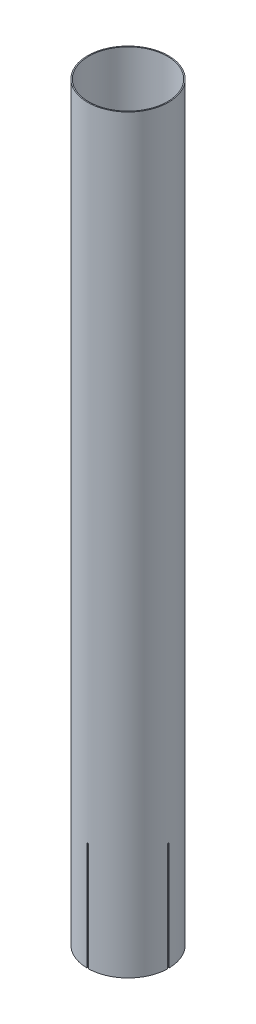
ISO-10303-21;
HEADER;
FILE_DESCRIPTION(('STEP AP214'),'2;1');
FILE_NAME('part.step','',(''),(''),'','','');
FILE_SCHEMA(('AUTOMOTIVE_DESIGN { 1 0 10303 214 1 1 1 1 }'));
ENDSEC;
DATA;
#1=APPLICATION_CONTEXT('core data for automotive mechanical design processes');
#2=APPLICATION_PROTOCOL_DEFINITION('international standard','automotive_design',2000,#1);
#3=PRODUCT_CONTEXT('',#1,'mechanical');
#4=PRODUCT('Part','Part','',(#3));
#5=PRODUCT_RELATED_PRODUCT_CATEGORY('part','',(#4));
#6=PRODUCT_DEFINITION_FORMATION('','',#4);
#7=PRODUCT_DEFINITION_CONTEXT('part definition',#1,'design');
#8=PRODUCT_DEFINITION('design','',#6,#7);
#9=PRODUCT_DEFINITION_SHAPE('','',#8);
#10=(LENGTH_UNIT() NAMED_UNIT(*) SI_UNIT(.MILLI.,.METRE.));
#11=(NAMED_UNIT(*) PLANE_ANGLE_UNIT() SI_UNIT($,.RADIAN.));
#12=(NAMED_UNIT(*) SI_UNIT($,.STERADIAN.) SOLID_ANGLE_UNIT());
#13=UNCERTAINTY_MEASURE_WITH_UNIT(LENGTH_MEASURE(1.E-05),#10,'distance_accuracy_value','');
#14=(GEOMETRIC_REPRESENTATION_CONTEXT(3) GLOBAL_UNCERTAINTY_ASSIGNED_CONTEXT((#13)) GLOBAL_UNIT_ASSIGNED_CONTEXT((#10,
#11,#12)) REPRESENTATION_CONTEXT('',''));
#15=CARTESIAN_POINT('',(0.,0.,0.));
#16=DIRECTION('',(0.,0.,1.));
#17=DIRECTION('',(1.,0.,0.));
#18=AXIS2_PLACEMENT_3D('',#15,#16,#17);
#19=CARTESIAN_POINT('',(78.2,0.,0.));
#20=DIRECTION('',(0.,-1.,0.));
#21=DIRECTION('',(0.,0.,-1.));
#22=AXIS2_PLACEMENT_3D('',#19,#20,#21);
#23=PLANE('',#22);
#24=CARTESIAN_POINT('',(0.,0.,0.));
#25=DIRECTION('',(0.,-1.,0.));
#26=DIRECTION('',(0.,0.,-1.));
#27=AXIS2_PLACEMENT_3D('',#24,#25,#26);
#28=CIRCLE('',#27,76.2);
#29=CARTESIAN_POINT('',(1.50000000000027,0.,-76.1852347899513));
#30=VERTEX_POINT('',#29);
#31=CARTESIAN_POINT('',(76.1852347899513,0.,-1.5));
#32=VERTEX_POINT('',#31);
#33=EDGE_CURVE('E258',#30,#32,#28,.T.);
#34=ORIENTED_EDGE('',*,*,#33,.F.);
#35=DIRECTION('',(0.,0.,1.));
#36=VECTOR('',#35,1.);
#37=CARTESIAN_POINT('',(1.50000000000065,0.,-185.2));
#38=LINE('',#37,#36);
#39=CARTESIAN_POINT('',(1.50000000000027,0.,-78.1856124872089));
#40=VERTEX_POINT('',#39);
#41=EDGE_CURVE('E310',#40,#30,#38,.T.);
#42=ORIENTED_EDGE('',*,*,#41,.F.);
#43=CARTESIAN_POINT('',(0.,0.,0.));
#44=DIRECTION('',(0.,-1.,0.));
#45=DIRECTION('',(0.,0.,-1.));
#46=AXIS2_PLACEMENT_3D('',#43,#44,#45);
#47=CIRCLE('',#46,78.2);
#48=CARTESIAN_POINT('',(78.1856124872089,0.,-1.5));
#49=VERTEX_POINT('',#48);
#50=EDGE_CURVE('E244',#40,#49,#47,.T.);
#51=ORIENTED_EDGE('',*,*,#50,.T.);
#52=DIRECTION('',(-1.,0.,0.));
#53=VECTOR('',#52,1.);
#54=CARTESIAN_POINT('',(185.2,0.,-1.5));
#55=LINE('',#54,#53);
#56=EDGE_CURVE('E306',#49,#32,#55,.T.);
#57=ORIENTED_EDGE('',*,*,#56,.T.);
#58=EDGE_LOOP('',(#34,#42,#51,#57));
#59=FACE_BOUND('',#58,.T.);
#60=ADVANCED_FACE('F41',(#59),#23,.T.);
#61=CARTESIAN_POINT('',(76.1852347899513,0.,1.5));
#62=VERTEX_POINT('',#61);
#63=CARTESIAN_POINT('',(1.4999999999992,0.,76.1852347899513));
#64=VERTEX_POINT('',#63);
#65=EDGE_CURVE('E186',#62,#64,#28,.T.);
#66=ORIENTED_EDGE('',*,*,#65,.F.);
#67=DIRECTION('',(-1.,0.,0.));
#68=VECTOR('',#67,1.);
#69=CARTESIAN_POINT('',(185.2,0.,1.5));
#70=LINE('',#69,#68);
#71=CARTESIAN_POINT('',(78.1856124872089,0.,1.5));
#72=VERTEX_POINT('',#71);
#73=EDGE_CURVE('E177',#72,#62,#70,.T.);
#74=ORIENTED_EDGE('',*,*,#73,.F.);
#75=CARTESIAN_POINT('',(1.49999999999918,0.,78.1856124872089));
#76=VERTEX_POINT('',#75);
#77=EDGE_CURVE('E359',#72,#76,#47,.T.);
#78=ORIENTED_EDGE('',*,*,#77,.T.);
#79=DIRECTION('',(0.,0.,-1.));
#80=VECTOR('',#79,1.);
#81=CARTESIAN_POINT('',(1.49999999999806,0.,185.2));
#82=LINE('',#81,#80);
#83=EDGE_CURVE('E178',#76,#64,#82,.T.);
#84=ORIENTED_EDGE('',*,*,#83,.T.);
#85=EDGE_LOOP('',(#66,#74,#78,#84));
#86=FACE_BOUND('',#85,.T.);
#87=ADVANCED_FACE('F381',(#86),#23,.T.);
#88=DIRECTION('',(0.,0.,1.));
#89=VECTOR('',#88,1.);
#90=CARTESIAN_POINT('',(-1.49999999999935,0.,-185.2));
#91=LINE('',#90,#89);
#92=CARTESIAN_POINT('',(-1.50000000000027,0.,76.1852347899513));
#93=VERTEX_POINT('',#92);
#94=CARTESIAN_POINT('',(-1.50000000000027,0.,78.185612487209));
#95=VERTEX_POINT('',#94);
#96=EDGE_CURVE('E319',#93,#95,#91,.T.);
#97=ORIENTED_EDGE('',*,*,#96,.T.);
#98=CARTESIAN_POINT('',(-78.1856124872089,0.,1.5));
#99=VERTEX_POINT('',#98);
#100=EDGE_CURVE('E238',#95,#99,#47,.T.);
#101=ORIENTED_EDGE('',*,*,#100,.T.);
#102=DIRECTION('',(1.,0.,0.));
#103=VECTOR('',#102,1.);
#104=CARTESIAN_POINT('',(-185.2,0.,1.5));
#105=LINE('',#104,#103);
#106=CARTESIAN_POINT('',(-76.1852347899513,0.,1.5));
#107=VERTEX_POINT('',#106);
#108=EDGE_CURVE('E218',#99,#107,#105,.T.);
#109=ORIENTED_EDGE('',*,*,#108,.T.);
#110=EDGE_CURVE('E252',#93,#107,#28,.T.);
#111=ORIENTED_EDGE('',*,*,#110,.F.);
#112=EDGE_LOOP('',(#97,#101,#109,#111));
#113=FACE_BOUND('',#112,.T.);
#114=ADVANCED_FACE('F365',(#113),#23,.T.);
#115=CARTESIAN_POINT('',(-1.49999999999973,0.,-78.1856124872089));
#116=VERTEX_POINT('',#115);
#117=CARTESIAN_POINT('',(-1.49999999999973,0.,-76.1852347899513));
#118=VERTEX_POINT('',#117);
#119=EDGE_CURVE('E322',#116,#118,#91,.T.);
#120=ORIENTED_EDGE('',*,*,#119,.T.);
#121=CARTESIAN_POINT('',(-76.1852347899513,0.,-1.5));
#122=VERTEX_POINT('',#121);
#123=EDGE_CURVE('E253',#122,#118,#28,.T.);
#124=ORIENTED_EDGE('',*,*,#123,.F.);
#125=DIRECTION('',(1.,0.,0.));
#126=VECTOR('',#125,1.);
#127=CARTESIAN_POINT('',(-185.2,0.,-1.5));
#128=LINE('',#127,#126);
#129=CARTESIAN_POINT('',(-78.1856124872089,0.,-1.5));
#130=VERTEX_POINT('',#129);
#131=EDGE_CURVE('E212',#130,#122,#128,.T.);
#132=ORIENTED_EDGE('',*,*,#131,.F.);
#133=EDGE_CURVE('E239',#130,#116,#47,.T.);
#134=ORIENTED_EDGE('',*,*,#133,.T.);
#135=EDGE_LOOP('',(#120,#124,#132,#134));
#136=FACE_BOUND('',#135,.T.);
#137=ADVANCED_FACE('F43',(#136),#23,.T.);
#138=CARTESIAN_POINT('',(0.,0.,0.));
#139=DIRECTION('',(0.,-1.,0.));
#140=DIRECTION('',(0.,0.,-1.));
#141=AXIS2_PLACEMENT_3D('',#138,#139,#140);
#142=CYLINDRICAL_SURFACE('',#141,76.2);
#143=DIRECTION('',(0.,-1.,0.));
#144=VECTOR('',#143,1.);
#145=CARTESIAN_POINT('',(-1.49999999999973,0.,-76.1852347899513));
#146=LINE('',#145,#144);
#147=CARTESIAN_POINT('',(-1.49999999999973,210.,-76.1852347899513));
#148=VERTEX_POINT('',#147);
#149=EDGE_CURVE('E207',#148,#118,#146,.T.);
#150=ORIENTED_EDGE('',*,*,#149,.F.);
#151=CARTESIAN_POINT('',(0.,210.,0.));
#152=DIRECTION('',(0.,-1.,0.));
#153=DIRECTION('',(0.,0.,-1.));
#154=AXIS2_PLACEMENT_3D('',#151,#152,#153);
#155=CIRCLE('',#154,76.2);
#156=CARTESIAN_POINT('',(1.50000000000027,210.,-76.1852347899513));
#157=VERTEX_POINT('',#156);
#158=EDGE_CURVE('E168',#148,#157,#155,.T.);
#159=ORIENTED_EDGE('',*,*,#158,.T.);
#160=DIRECTION('',(0.,-1.,0.));
#161=VECTOR('',#160,1.);
#162=CARTESIAN_POINT('',(1.50000000000027,0.,-76.1852347899513));
#163=LINE('',#162,#161);
#164=EDGE_CURVE('E200',#157,#30,#163,.T.);
#165=ORIENTED_EDGE('',*,*,#164,.T.);
#166=ORIENTED_EDGE('',*,*,#33,.T.);
#167=DIRECTION('',(0.,-1.,0.));
#168=VECTOR('',#167,1.);
#169=CARTESIAN_POINT('',(76.1852347899513,0.,-1.5));
#170=LINE('',#169,#168);
#171=CARTESIAN_POINT('',(76.1852347899513,210.,-1.5));
#172=VERTEX_POINT('',#171);
#173=EDGE_CURVE('E192',#172,#32,#170,.T.);
#174=ORIENTED_EDGE('',*,*,#173,.F.);
#175=CARTESIAN_POINT('',(76.1852347899513,210.,1.5));
#176=VERTEX_POINT('',#175);
#177=EDGE_CURVE('E167',#172,#176,#155,.T.);
#178=ORIENTED_EDGE('',*,*,#177,.T.);
#179=DIRECTION('',(0.,-1.,0.));
#180=VECTOR('',#179,1.);
#181=CARTESIAN_POINT('',(76.1852347899513,0.,1.5));
#182=LINE('',#181,#180);
#183=EDGE_CURVE('E188',#176,#62,#182,.T.);
#184=ORIENTED_EDGE('',*,*,#183,.T.);
#185=ORIENTED_EDGE('',*,*,#65,.T.);
#186=DIRECTION('',(0.,-1.,0.));
#187=VECTOR('',#186,1.);
#188=CARTESIAN_POINT('',(1.4999999999992,0.,76.1852347899513));
#189=LINE('',#188,#187);
#190=CARTESIAN_POINT('',(1.4999999999992,210.,76.1852347899513));
#191=VERTEX_POINT('',#190);
#192=EDGE_CURVE('E172',#191,#64,#189,.T.);
#193=ORIENTED_EDGE('',*,*,#192,.F.);
#194=CARTESIAN_POINT('',(-1.50000000000027,210.,76.1852347899513));
#195=VERTEX_POINT('',#194);
#196=EDGE_CURVE('E156',#191,#195,#155,.T.);
#197=ORIENTED_EDGE('',*,*,#196,.T.);
#198=DIRECTION('',(0.,-1.,0.));
#199=VECTOR('',#198,1.);
#200=CARTESIAN_POINT('',(-1.50000000000027,0.,76.1852347899513));
#201=LINE('',#200,#199);
#202=EDGE_CURVE('E204',#93,#195,#201,.F.);
#203=ORIENTED_EDGE('',*,*,#202,.F.);
#204=ORIENTED_EDGE('',*,*,#110,.T.);
#205=DIRECTION('',(0.,-1.,0.));
#206=VECTOR('',#205,1.);
#207=CARTESIAN_POINT('',(-76.1852347899513,0.,1.5));
#208=LINE('',#207,#206);
#209=CARTESIAN_POINT('',(-76.1852347899513,210.,1.5));
#210=VERTEX_POINT('',#209);
#211=EDGE_CURVE('E230',#210,#107,#208,.T.);
#212=ORIENTED_EDGE('',*,*,#211,.F.);
#213=CARTESIAN_POINT('',(0.,210.,0.));
#214=DIRECTION('',(0.,-1.,0.));
#215=DIRECTION('',(0.,0.,-1.));
#216=AXIS2_PLACEMENT_3D('',#213,#214,#215);
#217=CIRCLE('',#216,76.2);
#218=CARTESIAN_POINT('',(-76.1852347899513,210.,-1.5));
#219=VERTEX_POINT('',#218);
#220=EDGE_CURVE('E234',#210,#219,#217,.T.);
#221=ORIENTED_EDGE('',*,*,#220,.T.);
#222=DIRECTION('',(0.,-1.,0.));
#223=VECTOR('',#222,1.);
#224=CARTESIAN_POINT('',(-76.1852347899513,0.,-1.5));
#225=LINE('',#224,#223);
#226=EDGE_CURVE('E226',#219,#122,#225,.T.);
#227=ORIENTED_EDGE('',*,*,#226,.T.);
#228=ORIENTED_EDGE('',*,*,#123,.T.);
#229=EDGE_LOOP('',(#150,#159,#165,#166,#174,#178,#184,#185,#193,#197,#203,#204,#212,#221,#227,#228));
#230=FACE_BOUND('',#229,.T.);
#231=CARTESIAN_POINT('',(0.,1450.,0.));
#232=DIRECTION('',(0.,-1.,0.));
#233=DIRECTION('',(0.,0.,-1.));
#234=AXIS2_PLACEMENT_3D('',#231,#232,#233);
#235=CIRCLE('',#234,76.2);
#236=CARTESIAN_POINT('',(0.,1450.,-76.2));
#237=VERTEX_POINT('',#236);
#238=EDGE_CURVE('E248',#237,#237,#235,.T.);
#239=ORIENTED_EDGE('',*,*,#238,.F.);
#240=EDGE_LOOP('',(#239));
#241=FACE_BOUND('',#240,.T.);
#242=ADVANCED_FACE('F182',(#230,#241),#142,.F.);
#243=CARTESIAN_POINT('',(78.2,1450.,0.));
#244=DIRECTION('',(0.,1.,0.));
#245=DIRECTION('',(0.,0.,1.));
#246=AXIS2_PLACEMENT_3D('',#243,#244,#245);
#247=PLANE('',#246);
#248=ORIENTED_EDGE('',*,*,#238,.T.);
#249=EDGE_LOOP('',(#248));
#250=FACE_BOUND('',#249,.T.);
#251=CARTESIAN_POINT('',(0.,1450.,0.));
#252=DIRECTION('',(0.,-1.,0.));
#253=DIRECTION('',(0.,0.,-1.));
#254=AXIS2_PLACEMENT_3D('',#251,#252,#253);
#255=CIRCLE('',#254,78.2);
#256=CARTESIAN_POINT('',(0.,1450.,-78.2));
#257=VERTEX_POINT('',#256);
#258=EDGE_CURVE('E243',#257,#257,#255,.T.);
#259=ORIENTED_EDGE('',*,*,#258,.F.);
#260=EDGE_LOOP('',(#259));
#261=FACE_BOUND('',#260,.T.);
#262=ADVANCED_FACE('F390',(#250,#261),#247,.T.);
#263=CARTESIAN_POINT('',(0.,0.,0.));
#264=DIRECTION('',(0.,-1.,0.));
#265=DIRECTION('',(0.,0.,-1.));
#266=AXIS2_PLACEMENT_3D('',#263,#264,#265);
#267=CYLINDRICAL_SURFACE('',#266,78.2);
#268=DIRECTION('',(0.,-1.,0.));
#269=VECTOR('',#268,1.);
#270=CARTESIAN_POINT('',(-1.49999999999973,0.,-78.1856124872089));
#271=LINE('',#270,#269);
#272=CARTESIAN_POINT('',(-1.49999999999973,210.,-78.1856124872089));
#273=VERTEX_POINT('',#272);
#274=EDGE_CURVE('E11',#116,#273,#271,.F.);
#275=ORIENTED_EDGE('',*,*,#274,.F.);
#276=ORIENTED_EDGE('',*,*,#133,.F.);
#277=DIRECTION('',(0.,-1.,0.));
#278=VECTOR('',#277,1.);
#279=CARTESIAN_POINT('',(-78.1856124872089,0.,-1.5));
#280=LINE('',#279,#278);
#281=CARTESIAN_POINT('',(-78.1856124872089,210.,-1.5));
#282=VERTEX_POINT('',#281);
#283=EDGE_CURVE('E257',#130,#282,#280,.F.);
#284=ORIENTED_EDGE('',*,*,#283,.T.);
#285=CARTESIAN_POINT('',(0.,210.,0.));
#286=DIRECTION('',(0.,-1.,0.));
#287=DIRECTION('',(0.,0.,-1.));
#288=AXIS2_PLACEMENT_3D('',#285,#286,#287);
#289=CIRCLE('',#288,78.2);
#290=CARTESIAN_POINT('',(-78.1856124872089,210.,1.5));
#291=VERTEX_POINT('',#290);
#292=EDGE_CURVE('E262',#282,#291,#289,.F.);
#293=ORIENTED_EDGE('',*,*,#292,.T.);
#294=DIRECTION('',(0.,-1.,0.));
#295=VECTOR('',#294,1.);
#296=CARTESIAN_POINT('',(-78.1856124872089,0.,1.5));
#297=LINE('',#296,#295);
#298=EDGE_CURVE('E265',#99,#291,#297,.F.);
#299=ORIENTED_EDGE('',*,*,#298,.F.);
#300=ORIENTED_EDGE('',*,*,#100,.F.);
#301=DIRECTION('',(0.,-1.,0.));
#302=VECTOR('',#301,1.);
#303=CARTESIAN_POINT('',(-1.50000000000027,0.,78.1856124872089));
#304=LINE('',#303,#302);
#305=CARTESIAN_POINT('',(-1.50000000000027,210.,78.1856124872089));
#306=VERTEX_POINT('',#305);
#307=EDGE_CURVE('E274',#306,#95,#304,.T.);
#308=ORIENTED_EDGE('',*,*,#307,.F.);
#309=CARTESIAN_POINT('',(0.,210.,0.));
#310=DIRECTION('',(0.,-1.,0.));
#311=DIRECTION('',(0.,0.,-1.));
#312=AXIS2_PLACEMENT_3D('',#309,#310,#311);
#313=CIRCLE('',#312,78.2);
#314=CARTESIAN_POINT('',(1.49999999999918,210.,78.185612487209));
#315=VERTEX_POINT('',#314);
#316=EDGE_CURVE('E271',#306,#315,#313,.F.);
#317=ORIENTED_EDGE('',*,*,#316,.T.);
#318=DIRECTION('',(0.,-1.,0.));
#319=VECTOR('',#318,1.);
#320=CARTESIAN_POINT('',(1.49999999999918,0.,78.185612487209));
#321=LINE('',#320,#319);
#322=EDGE_CURVE('E175',#76,#315,#321,.F.);
#323=ORIENTED_EDGE('',*,*,#322,.F.);
#324=ORIENTED_EDGE('',*,*,#77,.F.);
#325=DIRECTION('',(0.,-1.,0.));
#326=VECTOR('',#325,1.);
#327=CARTESIAN_POINT('',(78.1856124872089,0.,1.5));
#328=LINE('',#327,#326);
#329=CARTESIAN_POINT('',(78.1856124872089,210.,1.5));
#330=VERTEX_POINT('',#329);
#331=EDGE_CURVE('E278',#72,#330,#328,.F.);
#332=ORIENTED_EDGE('',*,*,#331,.T.);
#333=CARTESIAN_POINT('',(78.1856124872089,210.,-1.5));
#334=VERTEX_POINT('',#333);
#335=EDGE_CURVE('E275',#330,#334,#313,.F.);
#336=ORIENTED_EDGE('',*,*,#335,.T.);
#337=DIRECTION('',(0.,-1.,0.));
#338=VECTOR('',#337,1.);
#339=CARTESIAN_POINT('',(78.1856124872089,0.,-1.5));
#340=LINE('',#339,#338);
#341=EDGE_CURVE('E282',#49,#334,#340,.F.);
#342=ORIENTED_EDGE('',*,*,#341,.F.);
#343=ORIENTED_EDGE('',*,*,#50,.F.);
#344=DIRECTION('',(0.,-1.,0.));
#345=VECTOR('',#344,1.);
#346=CARTESIAN_POINT('',(1.50000000000027,0.,-78.1856124872089));
#347=LINE('',#346,#345);
#348=CARTESIAN_POINT('',(1.50000000000027,210.,-78.1856124872089));
#349=VERTEX_POINT('',#348);
#350=EDGE_CURVE('E285',#40,#349,#347,.F.);
#351=ORIENTED_EDGE('',*,*,#350,.T.);
#352=EDGE_CURVE('E50',#349,#273,#313,.F.);
#353=ORIENTED_EDGE('',*,*,#352,.T.);
#354=EDGE_LOOP('',(#275,#276,#284,#293,#299,#300,#308,#317,#323,#324,#332,#336,#342,#343,#351,#353));
#355=FACE_BOUND('',#354,.T.);
#356=ORIENTED_EDGE('',*,*,#258,.T.);
#357=EDGE_LOOP('',(#356));
#358=FACE_BOUND('',#357,.T.);
#359=ADVANCED_FACE('F294',(#355,#358),#267,.T.);
#360=CARTESIAN_POINT('',(-78.2000000000001,210.,1.5));
#361=DIRECTION('',(0.,-1.,0.));
#362=DIRECTION('',(0.,0.,-1.));
#363=AXIS2_PLACEMENT_3D('',#360,#361,#362);
#364=PLANE('',#363);
#365=DIRECTION('',(-1.,0.,0.));
#366=VECTOR('',#365,1.);
#367=CARTESIAN_POINT('',(-78.2000000000001,210.,1.5));
#368=LINE('',#367,#366);
#369=EDGE_CURVE('E222',#210,#291,#368,.T.);
#370=ORIENTED_EDGE('',*,*,#369,.T.);
#371=ORIENTED_EDGE('',*,*,#292,.F.);
#372=DIRECTION('',(-1.,0.,0.));
#373=VECTOR('',#372,1.);
#374=CARTESIAN_POINT('',(-78.2000000000001,210.,-1.5));
#375=LINE('',#374,#373);
#376=EDGE_CURVE('E215',#219,#282,#375,.T.);
#377=ORIENTED_EDGE('',*,*,#376,.F.);
#378=ORIENTED_EDGE('',*,*,#220,.F.);
#379=EDGE_LOOP('',(#370,#371,#377,#378));
#380=FACE_BOUND('',#379,.T.);
#381=ADVANCED_FACE('F345',(#380),#364,.T.);
#382=CARTESIAN_POINT('',(0.,0.,1.5));
#383=DIRECTION('',(0.,0.,1.));
#384=DIRECTION('',(1.,0.,0.));
#385=AXIS2_PLACEMENT_3D('',#382,#383,#384);
#386=PLANE('',#385);
#387=ORIENTED_EDGE('',*,*,#211,.T.);
#388=ORIENTED_EDGE('',*,*,#108,.F.);
#389=ORIENTED_EDGE('',*,*,#298,.T.);
#390=ORIENTED_EDGE('',*,*,#369,.F.);
#391=EDGE_LOOP('',(#387,#388,#389,#390));
#392=FACE_BOUND('',#391,.T.);
#393=ADVANCED_FACE('F349',(#392),#386,.F.);
#394=CARTESIAN_POINT('',(0.,0.,-1.5));
#395=DIRECTION('',(0.,0.,1.));
#396=DIRECTION('',(1.,0.,0.));
#397=AXIS2_PLACEMENT_3D('',#394,#395,#396);
#398=PLANE('',#397);
#399=ORIENTED_EDGE('',*,*,#376,.T.);
#400=ORIENTED_EDGE('',*,*,#283,.F.);
#401=ORIENTED_EDGE('',*,*,#131,.T.);
#402=ORIENTED_EDGE('',*,*,#226,.F.);
#403=EDGE_LOOP('',(#399,#400,#401,#402));
#404=FACE_BOUND('',#403,.T.);
#405=ADVANCED_FACE('F342',(#404),#398,.T.);
#406=CARTESIAN_POINT('',(-1.5,0.,0.));
#407=DIRECTION('',(-1.,0.,0.));
#408=DIRECTION('',(0.,0.,1.));
#409=AXIS2_PLACEMENT_3D('',#406,#407,#408);
#410=PLANE('',#409);
#411=ORIENTED_EDGE('',*,*,#202,.T.);
#412=DIRECTION('',(0.,0.,-1.));
#413=VECTOR('',#412,1.);
#414=CARTESIAN_POINT('',(-1.49999999999973,210.,-78.2000000000001));
#415=LINE('',#414,#413);
#416=EDGE_CURVE('E162',#306,#195,#415,.T.);
#417=ORIENTED_EDGE('',*,*,#416,.F.);
#418=ORIENTED_EDGE('',*,*,#307,.T.);
#419=ORIENTED_EDGE('',*,*,#96,.F.);
#420=EDGE_LOOP('',(#411,#417,#418,#419));
#421=FACE_BOUND('',#420,.T.);
#422=ADVANCED_FACE('F368',(#421),#410,.F.);
#423=CARTESIAN_POINT('',(1.5,0.,0.));
#424=DIRECTION('',(1.,0.,0.));
#425=DIRECTION('',(0.,0.,-1.));
#426=AXIS2_PLACEMENT_3D('',#423,#424,#425);
#427=PLANE('',#426);
#428=ORIENTED_EDGE('',*,*,#192,.T.);
#429=ORIENTED_EDGE('',*,*,#83,.F.);
#430=ORIENTED_EDGE('',*,*,#322,.T.);
#431=DIRECTION('',(0.,0.,1.));
#432=VECTOR('',#431,1.);
#433=CARTESIAN_POINT('',(1.49999999999918,210.,78.2000000000001));
#434=LINE('',#433,#432);
#435=EDGE_CURVE('E159',#191,#315,#434,.T.);
#436=ORIENTED_EDGE('',*,*,#435,.F.);
#437=EDGE_LOOP('',(#428,#429,#430,#436));
#438=FACE_BOUND('',#437,.T.);
#439=ADVANCED_FACE('F171',(#438),#427,.F.);
#440=CARTESIAN_POINT('',(-1.49999999999973,210.,-78.2000000000001));
#441=DIRECTION('',(0.,-1.,0.));
#442=DIRECTION('',(0.,0.,-1.));
#443=AXIS2_PLACEMENT_3D('',#440,#441,#442);
#444=PLANE('',#443);
#445=ORIENTED_EDGE('',*,*,#435,.T.);
#446=ORIENTED_EDGE('',*,*,#316,.F.);
#447=ORIENTED_EDGE('',*,*,#416,.T.);
#448=ORIENTED_EDGE('',*,*,#196,.F.);
#449=EDGE_LOOP('',(#445,#446,#447,#448));
#450=FACE_BOUND('',#449,.T.);
#451=ADVANCED_FACE('F158',(#450),#444,.T.);
#452=CARTESIAN_POINT('',(0.,0.,1.5));
#453=DIRECTION('',(0.,0.,-1.));
#454=DIRECTION('',(-1.,0.,0.));
#455=AXIS2_PLACEMENT_3D('',#452,#453,#454);
#456=PLANE('',#455);
#457=DIRECTION('',(1.,0.,0.));
#458=VECTOR('',#457,1.);
#459=CARTESIAN_POINT('',(78.2000000000001,210.,1.5));
#460=LINE('',#459,#458);
#461=EDGE_CURVE('E65',#176,#330,#460,.T.);
#462=ORIENTED_EDGE('',*,*,#461,.T.);
#463=ORIENTED_EDGE('',*,*,#331,.F.);
#464=ORIENTED_EDGE('',*,*,#73,.T.);
#465=ORIENTED_EDGE('',*,*,#183,.F.);
#466=EDGE_LOOP('',(#462,#463,#464,#465));
#467=FACE_BOUND('',#466,.T.);
#468=ADVANCED_FACE('F465',(#467),#456,.T.);
#469=CARTESIAN_POINT('',(0.,0.,-1.5));
#470=DIRECTION('',(0.,0.,-1.));
#471=DIRECTION('',(-1.,0.,0.));
#472=AXIS2_PLACEMENT_3D('',#469,#470,#471);
#473=PLANE('',#472);
#474=ORIENTED_EDGE('',*,*,#173,.T.);
#475=ORIENTED_EDGE('',*,*,#56,.F.);
#476=ORIENTED_EDGE('',*,*,#341,.T.);
#477=DIRECTION('',(1.,0.,0.));
#478=VECTOR('',#477,1.);
#479=CARTESIAN_POINT('',(78.2000000000001,210.,-1.5));
#480=LINE('',#479,#478);
#481=EDGE_CURVE('E303',#172,#334,#480,.T.);
#482=ORIENTED_EDGE('',*,*,#481,.F.);
#483=EDGE_LOOP('',(#474,#475,#476,#482));
#484=FACE_BOUND('',#483,.T.);
#485=ADVANCED_FACE('F302',(#484),#473,.F.);
#486=ORIENTED_EDGE('',*,*,#481,.T.);
#487=ORIENTED_EDGE('',*,*,#335,.F.);
#488=ORIENTED_EDGE('',*,*,#461,.F.);
#489=ORIENTED_EDGE('',*,*,#177,.F.);
#490=EDGE_LOOP('',(#486,#487,#488,#489));
#491=FACE_BOUND('',#490,.T.);
#492=ADVANCED_FACE('F307',(#491),#444,.T.);
#493=ORIENTED_EDGE('',*,*,#149,.T.);
#494=ORIENTED_EDGE('',*,*,#119,.F.);
#495=ORIENTED_EDGE('',*,*,#274,.T.);
#496=EDGE_CURVE('E194',#148,#273,#415,.T.);
#497=ORIENTED_EDGE('',*,*,#496,.F.);
#498=EDGE_LOOP('',(#493,#494,#495,#497));
#499=FACE_BOUND('',#498,.T.);
#500=ADVANCED_FACE('F336',(#499),#410,.F.);
#501=ORIENTED_EDGE('',*,*,#496,.T.);
#502=ORIENTED_EDGE('',*,*,#352,.F.);
#503=DIRECTION('',(0.,0.,-1.));
#504=VECTOR('',#503,1.);
#505=CARTESIAN_POINT('',(1.50000000000027,210.,-78.2000000000001));
#506=LINE('',#505,#504);
#507=EDGE_CURVE('E57',#157,#349,#506,.T.);
#508=ORIENTED_EDGE('',*,*,#507,.F.);
#509=ORIENTED_EDGE('',*,*,#158,.F.);
#510=EDGE_LOOP('',(#501,#502,#508,#509));
#511=FACE_BOUND('',#510,.T.);
#512=ADVANCED_FACE('F334',(#511),#444,.T.);
#513=CARTESIAN_POINT('',(1.5,0.,0.));
#514=DIRECTION('',(-1.,0.,0.));
#515=DIRECTION('',(0.,0.,1.));
#516=AXIS2_PLACEMENT_3D('',#513,#514,#515);
#517=PLANE('',#516);
#518=ORIENTED_EDGE('',*,*,#507,.T.);
#519=ORIENTED_EDGE('',*,*,#350,.F.);
#520=ORIENTED_EDGE('',*,*,#41,.T.);
#521=ORIENTED_EDGE('',*,*,#164,.F.);
#522=EDGE_LOOP('',(#518,#519,#520,#521));
#523=FACE_BOUND('',#522,.T.);
#524=ADVANCED_FACE('F507',(#523),#517,.T.);
#525=CLOSED_SHELL('',(#60,#87,#114,#137,#242,#262,#359,#381,#393,#405,#422,#439,#451,#468,#485,
#492,#500,#512,#524));
#526=MANIFOLD_SOLID_BREP('B2',#525);
#527=ADVANCED_BREP_SHAPE_REPRESENTATION('',(#18,#526),#14);
#528=SHAPE_DEFINITION_REPRESENTATION(#9,#527);
ENDSEC;
END-ISO-10303-21;
